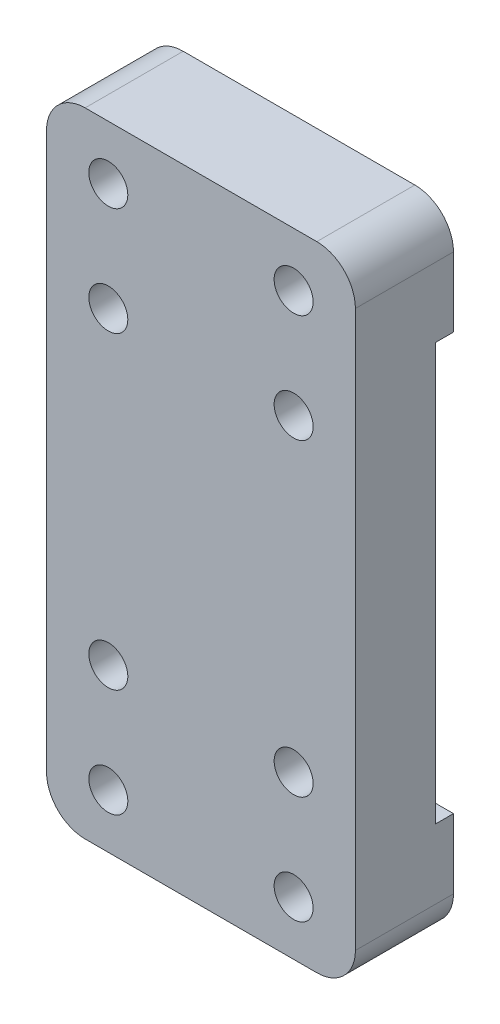
ISO-10303-21;
HEADER;
FILE_DESCRIPTION(('STEP AP214'),'2;1');
FILE_NAME('part.step','',(''),(''),'','','');
FILE_SCHEMA(('AUTOMOTIVE_DESIGN { 1 0 10303 214 1 1 1 1 }'));
ENDSEC;
DATA;
#1=APPLICATION_CONTEXT('core data for automotive mechanical design processes');
#2=APPLICATION_PROTOCOL_DEFINITION('international standard','automotive_design',2000,#1);
#3=PRODUCT_CONTEXT('',#1,'mechanical');
#4=PRODUCT('Part','Part','',(#3));
#5=PRODUCT_RELATED_PRODUCT_CATEGORY('part','',(#4));
#6=PRODUCT_DEFINITION_FORMATION('','',#4);
#7=PRODUCT_DEFINITION_CONTEXT('part definition',#1,'design');
#8=PRODUCT_DEFINITION('design','',#6,#7);
#9=PRODUCT_DEFINITION_SHAPE('','',#8);
#10=(LENGTH_UNIT() NAMED_UNIT(*) SI_UNIT(.MILLI.,.METRE.));
#11=(NAMED_UNIT(*) PLANE_ANGLE_UNIT() SI_UNIT($,.RADIAN.));
#12=(NAMED_UNIT(*) SI_UNIT($,.STERADIAN.) SOLID_ANGLE_UNIT());
#13=UNCERTAINTY_MEASURE_WITH_UNIT(LENGTH_MEASURE(1.E-05),#10,'distance_accuracy_value','');
#14=(GEOMETRIC_REPRESENTATION_CONTEXT(3) GLOBAL_UNCERTAINTY_ASSIGNED_CONTEXT((#13)) GLOBAL_UNIT_ASSIGNED_CONTEXT((#10,
#11,#12)) REPRESENTATION_CONTEXT('',''));
#15=CARTESIAN_POINT('',(0.,0.,0.));
#16=DIRECTION('',(0.,0.,1.));
#17=DIRECTION('',(1.,0.,0.));
#18=AXIS2_PLACEMENT_3D('',#15,#16,#17);
#19=CARTESIAN_POINT('',(0.,0.,0.));
#20=DIRECTION('',(0.,0.,-1.));
#21=DIRECTION('',(-1.,0.,0.));
#22=AXIS2_PLACEMENT_3D('',#19,#20,#21);
#23=PLANE('',#22);
#24=DIRECTION('',(1.,0.,0.));
#25=VECTOR('',#24,1.);
#26=CARTESIAN_POINT('',(-20.,-40.9999999999999,0.));
#27=LINE('',#26,#25);
#28=CARTESIAN_POINT('',(-15.,-40.9999999999999,0.));
#29=VERTEX_POINT('',#28);
#30=CARTESIAN_POINT('',(15.,-40.9999999999999,0.));
#31=VERTEX_POINT('',#30);
#32=EDGE_CURVE('E217',#29,#31,#27,.T.);
#33=ORIENTED_EDGE('',*,*,#32,.F.);
#34=CARTESIAN_POINT('',(-15.,-36.,0.));
#35=DIRECTION('',(0.,0.,-1.));
#36=DIRECTION('',(-1.,0.,0.));
#37=AXIS2_PLACEMENT_3D('',#34,#35,#36);
#38=CIRCLE('',#37,5.);
#39=CARTESIAN_POINT('',(-20.,-36.,0.));
#40=VERTEX_POINT('',#39);
#41=EDGE_CURVE('E244',#29,#40,#38,.T.);
#42=ORIENTED_EDGE('',*,*,#41,.T.);
#43=DIRECTION('',(0.,-1.,0.));
#44=VECTOR('',#43,1.);
#45=CARTESIAN_POINT('',(-20.,-40.9999999999999,0.));
#46=LINE('',#45,#44);
#47=CARTESIAN_POINT('',(-20.,-26.9999999999999,0.));
#48=VERTEX_POINT('',#47);
#49=EDGE_CURVE('E231',#48,#40,#46,.T.);
#50=ORIENTED_EDGE('',*,*,#49,.F.);
#51=DIRECTION('',(-1.,0.,0.));
#52=VECTOR('',#51,1.);
#53=CARTESIAN_POINT('',(20.,-26.9999999999999,0.));
#54=LINE('',#53,#52);
#55=CARTESIAN_POINT('',(20.,-26.9999999999999,0.));
#56=VERTEX_POINT('',#55);
#57=EDGE_CURVE('E154',#56,#48,#54,.T.);
#58=ORIENTED_EDGE('',*,*,#57,.F.);
#59=DIRECTION('',(0.,1.,0.));
#60=VECTOR('',#59,1.);
#61=CARTESIAN_POINT('',(20.,-40.9999999999999,0.));
#62=LINE('',#61,#60);
#63=CARTESIAN_POINT('',(20.,-36.,0.));
#64=VERTEX_POINT('',#63);
#65=EDGE_CURVE('E227',#64,#56,#62,.T.);
#66=ORIENTED_EDGE('',*,*,#65,.F.);
#67=CARTESIAN_POINT('',(15.,-36.,0.));
#68=DIRECTION('',(0.,0.,-1.));
#69=DIRECTION('',(-1.,0.,0.));
#70=AXIS2_PLACEMENT_3D('',#67,#68,#69);
#71=CIRCLE('',#70,5.);
#72=EDGE_CURVE('E242',#64,#31,#71,.T.);
#73=ORIENTED_EDGE('',*,*,#72,.T.);
#74=EDGE_LOOP('',(#33,#42,#50,#58,#66,#73));
#75=FACE_BOUND('',#74,.T.);
#76=CARTESIAN_POINT('',(-12.,-34.,0.));
#77=DIRECTION('',(0.,0.,1.));
#78=DIRECTION('',(-1.,0.,0.));
#79=AXIS2_PLACEMENT_3D('',#76,#77,#78);
#80=CIRCLE('',#79,2.525);
#81=CARTESIAN_POINT('',(-14.525,-34.,0.));
#82=VERTEX_POINT('',#81);
#83=EDGE_CURVE('E176',#82,#82,#80,.T.);
#84=ORIENTED_EDGE('',*,*,#83,.T.);
#85=EDGE_LOOP('',(#84));
#86=FACE_BOUND('',#85,.T.);
#87=CARTESIAN_POINT('',(12.,-34.,0.));
#88=DIRECTION('',(0.,0.,1.));
#89=DIRECTION('',(1.,0.,0.));
#90=AXIS2_PLACEMENT_3D('',#87,#88,#89);
#91=CIRCLE('',#90,2.52500000000001);
#92=CARTESIAN_POINT('',(14.525,-34.,0.));
#93=VERTEX_POINT('',#92);
#94=EDGE_CURVE('E185',#93,#93,#91,.T.);
#95=ORIENTED_EDGE('',*,*,#94,.T.);
#96=EDGE_LOOP('',(#95));
#97=FACE_BOUND('',#96,.T.);
#98=ADVANCED_FACE('F46',(#75,#86,#97),#23,.T.);
#99=CARTESIAN_POINT('',(0.,0.,12.7));
#100=DIRECTION('',(0.,0.,-1.));
#101=DIRECTION('',(-1.,0.,0.));
#102=AXIS2_PLACEMENT_3D('',#99,#100,#101);
#103=PLANE('',#102);
#104=DIRECTION('',(0.,-1.,0.));
#105=VECTOR('',#104,1.);
#106=CARTESIAN_POINT('',(-20.,-40.9999999999999,12.7));
#107=LINE('',#106,#105);
#108=CARTESIAN_POINT('',(-20.,36.,12.7));
#109=VERTEX_POINT('',#108);
#110=CARTESIAN_POINT('',(-20.,-36.,12.7));
#111=VERTEX_POINT('',#110);
#112=EDGE_CURVE('E220',#109,#111,#107,.T.);
#113=ORIENTED_EDGE('',*,*,#112,.T.);
#114=CARTESIAN_POINT('',(-15.,-36.,12.7));
#115=DIRECTION('',(0.,0.,-1.));
#116=DIRECTION('',(-1.,0.,0.));
#117=AXIS2_PLACEMENT_3D('',#114,#115,#116);
#118=CIRCLE('',#117,5.);
#119=CARTESIAN_POINT('',(-15.,-40.9999999999999,12.7));
#120=VERTEX_POINT('',#119);
#121=EDGE_CURVE('E256',#111,#120,#118,.F.);
#122=ORIENTED_EDGE('',*,*,#121,.T.);
#123=DIRECTION('',(1.,0.,0.));
#124=VECTOR('',#123,1.);
#125=CARTESIAN_POINT('',(-20.,-40.9999999999999,12.7));
#126=LINE('',#125,#124);
#127=CARTESIAN_POINT('',(15.,-40.9999999999999,12.7));
#128=VERTEX_POINT('',#127);
#129=EDGE_CURVE('E223',#120,#128,#126,.T.);
#130=ORIENTED_EDGE('',*,*,#129,.T.);
#131=CARTESIAN_POINT('',(15.,-36.,12.7));
#132=DIRECTION('',(0.,0.,-1.));
#133=DIRECTION('',(-1.,0.,0.));
#134=AXIS2_PLACEMENT_3D('',#131,#132,#133);
#135=CIRCLE('',#134,5.);
#136=CARTESIAN_POINT('',(20.,-36.,12.7));
#137=VERTEX_POINT('',#136);
#138=EDGE_CURVE('E254',#128,#137,#135,.F.);
#139=ORIENTED_EDGE('',*,*,#138,.T.);
#140=DIRECTION('',(0.,1.,0.));
#141=VECTOR('',#140,1.);
#142=CARTESIAN_POINT('',(20.,-40.9999999999999,12.7));
#143=LINE('',#142,#141);
#144=CARTESIAN_POINT('',(20.,36.,12.7));
#145=VERTEX_POINT('',#144);
#146=EDGE_CURVE('E213',#137,#145,#143,.T.);
#147=ORIENTED_EDGE('',*,*,#146,.T.);
#148=CARTESIAN_POINT('',(15.,36.,12.7));
#149=DIRECTION('',(0.,0.,-1.));
#150=DIRECTION('',(-1.,0.,0.));
#151=AXIS2_PLACEMENT_3D('',#148,#149,#150);
#152=CIRCLE('',#151,5.);
#153=CARTESIAN_POINT('',(15.,40.9999999999999,12.7));
#154=VERTEX_POINT('',#153);
#155=EDGE_CURVE('E252',#145,#154,#152,.F.);
#156=ORIENTED_EDGE('',*,*,#155,.T.);
#157=DIRECTION('',(-1.,0.,0.));
#158=VECTOR('',#157,1.);
#159=CARTESIAN_POINT('',(-20.,40.9999999999999,12.7));
#160=LINE('',#159,#158);
#161=CARTESIAN_POINT('',(-15.,40.9999999999999,12.7));
#162=VERTEX_POINT('',#161);
#163=EDGE_CURVE('E216',#154,#162,#160,.T.);
#164=ORIENTED_EDGE('',*,*,#163,.T.);
#165=CARTESIAN_POINT('',(-15.,36.,12.7));
#166=DIRECTION('',(0.,0.,-1.));
#167=DIRECTION('',(-1.,0.,0.));
#168=AXIS2_PLACEMENT_3D('',#165,#166,#167);
#169=CIRCLE('',#168,5.);
#170=EDGE_CURVE('E250',#162,#109,#169,.F.);
#171=ORIENTED_EDGE('',*,*,#170,.T.);
#172=EDGE_LOOP('',(#113,#122,#130,#139,#147,#156,#164,#171));
#173=FACE_BOUND('',#172,.T.);
#174=CARTESIAN_POINT('',(-12.,20.,12.7));
#175=DIRECTION('',(0.,0.,1.));
#176=DIRECTION('',(1.,0.,0.));
#177=AXIS2_PLACEMENT_3D('',#174,#175,#176);
#178=CIRCLE('',#177,2.525);
#179=CARTESIAN_POINT('',(-9.47500000000001,20.,12.7));
#180=VERTEX_POINT('',#179);
#181=EDGE_CURVE('E207',#180,#180,#178,.T.);
#182=ORIENTED_EDGE('',*,*,#181,.F.);
#183=EDGE_LOOP('',(#182));
#184=FACE_BOUND('',#183,.T.);
#185=CARTESIAN_POINT('',(-12.,34.,12.7));
#186=DIRECTION('',(0.,0.,1.));
#187=DIRECTION('',(1.,0.,0.));
#188=AXIS2_PLACEMENT_3D('',#185,#186,#187);
#189=CIRCLE('',#188,2.525);
#190=CARTESIAN_POINT('',(-9.47500000000001,34.,12.7));
#191=VERTEX_POINT('',#190);
#192=EDGE_CURVE('E204',#191,#191,#189,.T.);
#193=ORIENTED_EDGE('',*,*,#192,.F.);
#194=EDGE_LOOP('',(#193));
#195=FACE_BOUND('',#194,.T.);
#196=CARTESIAN_POINT('',(12.,34.,12.7));
#197=DIRECTION('',(0.,0.,1.));
#198=DIRECTION('',(-1.,0.,0.));
#199=AXIS2_PLACEMENT_3D('',#196,#197,#198);
#200=CIRCLE('',#199,2.525);
#201=CARTESIAN_POINT('',(9.47500000000001,34.,12.7));
#202=VERTEX_POINT('',#201);
#203=EDGE_CURVE('E198',#202,#202,#200,.T.);
#204=ORIENTED_EDGE('',*,*,#203,.F.);
#205=EDGE_LOOP('',(#204));
#206=FACE_BOUND('',#205,.T.);
#207=CARTESIAN_POINT('',(12.,20.,12.7));
#208=DIRECTION('',(0.,0.,1.));
#209=DIRECTION('',(-1.,0.,0.));
#210=AXIS2_PLACEMENT_3D('',#207,#208,#209);
#211=CIRCLE('',#210,2.525);
#212=CARTESIAN_POINT('',(9.47500000000001,20.,12.7));
#213=VERTEX_POINT('',#212);
#214=EDGE_CURVE('E194',#213,#213,#211,.T.);
#215=ORIENTED_EDGE('',*,*,#214,.F.);
#216=EDGE_LOOP('',(#215));
#217=FACE_BOUND('',#216,.T.);
#218=CARTESIAN_POINT('',(12.,-20.,12.7));
#219=DIRECTION('',(0.,0.,1.));
#220=DIRECTION('',(1.,0.,0.));
#221=AXIS2_PLACEMENT_3D('',#218,#219,#220);
#222=CIRCLE('',#221,2.52499999999999);
#223=CARTESIAN_POINT('',(14.525,-20.,12.7));
#224=VERTEX_POINT('',#223);
#225=EDGE_CURVE('E189',#224,#224,#222,.T.);
#226=ORIENTED_EDGE('',*,*,#225,.F.);
#227=EDGE_LOOP('',(#226));
#228=FACE_BOUND('',#227,.T.);
#229=CARTESIAN_POINT('',(12.,-34.,12.7));
#230=DIRECTION('',(0.,0.,1.));
#231=DIRECTION('',(1.,0.,0.));
#232=AXIS2_PLACEMENT_3D('',#229,#230,#231);
#233=CIRCLE('',#232,2.52500000000001);
#234=CARTESIAN_POINT('',(14.525,-34.,12.7));
#235=VERTEX_POINT('',#234);
#236=EDGE_CURVE('E186',#235,#235,#233,.T.);
#237=ORIENTED_EDGE('',*,*,#236,.F.);
#238=EDGE_LOOP('',(#237));
#239=FACE_BOUND('',#238,.T.);
#240=CARTESIAN_POINT('',(-12.,-20.,12.7));
#241=DIRECTION('',(0.,0.,1.));
#242=DIRECTION('',(-1.,0.,0.));
#243=AXIS2_PLACEMENT_3D('',#240,#241,#242);
#244=CIRCLE('',#243,2.525);
#245=CARTESIAN_POINT('',(-14.525,-20.,12.7));
#246=VERTEX_POINT('',#245);
#247=EDGE_CURVE('E180',#246,#246,#244,.T.);
#248=ORIENTED_EDGE('',*,*,#247,.F.);
#249=EDGE_LOOP('',(#248));
#250=FACE_BOUND('',#249,.T.);
#251=CARTESIAN_POINT('',(-12.,-34.,12.7));
#252=DIRECTION('',(0.,0.,1.));
#253=DIRECTION('',(-1.,0.,0.));
#254=AXIS2_PLACEMENT_3D('',#251,#252,#253);
#255=CIRCLE('',#254,2.525);
#256=CARTESIAN_POINT('',(-14.525,-34.,12.7));
#257=VERTEX_POINT('',#256);
#258=EDGE_CURVE('E177',#257,#257,#255,.T.);
#259=ORIENTED_EDGE('',*,*,#258,.F.);
#260=EDGE_LOOP('',(#259));
#261=FACE_BOUND('',#260,.T.);
#262=ADVANCED_FACE('F280',(#173,#184,#195,#206,#217,#228,#239,#250,#261),#103,.F.);
#263=DIRECTION('',(-1.,0.,0.));
#264=VECTOR('',#263,1.);
#265=CARTESIAN_POINT('',(-20.,40.9999999999999,0.));
#266=LINE('',#265,#264);
#267=CARTESIAN_POINT('',(15.,40.9999999999999,0.));
#268=VERTEX_POINT('',#267);
#269=CARTESIAN_POINT('',(-15.,40.9999999999999,0.));
#270=VERTEX_POINT('',#269);
#271=EDGE_CURVE('E229',#268,#270,#266,.T.);
#272=ORIENTED_EDGE('',*,*,#271,.F.);
#273=CARTESIAN_POINT('',(15.,36.,0.));
#274=DIRECTION('',(0.,0.,-1.));
#275=DIRECTION('',(-1.,0.,0.));
#276=AXIS2_PLACEMENT_3D('',#273,#274,#275);
#277=CIRCLE('',#276,5.);
#278=CARTESIAN_POINT('',(20.,36.,0.));
#279=VERTEX_POINT('',#278);
#280=EDGE_CURVE('E13',#268,#279,#277,.T.);
#281=ORIENTED_EDGE('',*,*,#280,.T.);
#282=CARTESIAN_POINT('',(20.,26.9999999999999,0.));
#283=VERTEX_POINT('',#282);
#284=EDGE_CURVE('E212',#283,#279,#62,.T.);
#285=ORIENTED_EDGE('',*,*,#284,.F.);
#286=DIRECTION('',(1.,0.,0.));
#287=VECTOR('',#286,1.);
#288=CARTESIAN_POINT('',(20.,26.9999999999999,0.));
#289=LINE('',#288,#287);
#290=CARTESIAN_POINT('',(-20.,26.9999999999999,0.));
#291=VERTEX_POINT('',#290);
#292=EDGE_CURVE('E308',#291,#283,#289,.T.);
#293=ORIENTED_EDGE('',*,*,#292,.F.);
#294=CARTESIAN_POINT('',(-20.,36.,0.));
#295=VERTEX_POINT('',#294);
#296=EDGE_CURVE('E159',#295,#291,#46,.T.);
#297=ORIENTED_EDGE('',*,*,#296,.F.);
#298=CARTESIAN_POINT('',(-15.,36.,0.));
#299=DIRECTION('',(0.,0.,-1.));
#300=DIRECTION('',(-1.,0.,0.));
#301=AXIS2_PLACEMENT_3D('',#298,#299,#300);
#302=CIRCLE('',#301,5.);
#303=EDGE_CURVE('E54',#295,#270,#302,.T.);
#304=ORIENTED_EDGE('',*,*,#303,.T.);
#305=EDGE_LOOP('',(#272,#281,#285,#293,#297,#304));
#306=FACE_BOUND('',#305,.T.);
#307=CARTESIAN_POINT('',(12.,34.,0.));
#308=DIRECTION('',(0.,0.,1.));
#309=DIRECTION('',(-1.,0.,0.));
#310=AXIS2_PLACEMENT_3D('',#307,#308,#309);
#311=CIRCLE('',#310,2.525);
#312=CARTESIAN_POINT('',(9.47500000000001,34.,0.));
#313=VERTEX_POINT('',#312);
#314=EDGE_CURVE('E197',#313,#313,#311,.T.);
#315=ORIENTED_EDGE('',*,*,#314,.T.);
#316=EDGE_LOOP('',(#315));
#317=FACE_BOUND('',#316,.T.);
#318=CARTESIAN_POINT('',(-12.,34.,0.));
#319=DIRECTION('',(0.,0.,1.));
#320=DIRECTION('',(1.,0.,0.));
#321=AXIS2_PLACEMENT_3D('',#318,#319,#320);
#322=CIRCLE('',#321,2.525);
#323=CARTESIAN_POINT('',(-9.47500000000001,34.,0.));
#324=VERTEX_POINT('',#323);
#325=EDGE_CURVE('E201',#324,#324,#322,.T.);
#326=ORIENTED_EDGE('',*,*,#325,.T.);
#327=EDGE_LOOP('',(#326));
#328=FACE_BOUND('',#327,.T.);
#329=ADVANCED_FACE('F271',(#306,#317,#328),#23,.T.);
#330=CARTESIAN_POINT('',(20.,-40.9999999999999,12.7));
#331=DIRECTION('',(-1.,0.,0.));
#332=DIRECTION('',(0.,0.,1.));
#333=AXIS2_PLACEMENT_3D('',#330,#331,#332);
#334=PLANE('',#333);
#335=ORIENTED_EDGE('',*,*,#146,.F.);
#336=DIRECTION('',(0.,0.,-1.));
#337=VECTOR('',#336,1.);
#338=CARTESIAN_POINT('',(20.,-36.,12.7));
#339=LINE('',#338,#337);
#340=EDGE_CURVE('E260',#137,#64,#339,.T.);
#341=ORIENTED_EDGE('',*,*,#340,.T.);
#342=ORIENTED_EDGE('',*,*,#65,.T.);
#343=DIRECTION('',(0.,0.,-1.));
#344=VECTOR('',#343,1.);
#345=CARTESIAN_POINT('',(20.,-26.9999999999999,2.30000000000002));
#346=LINE('',#345,#344);
#347=CARTESIAN_POINT('',(20.,-26.9999999999999,2.30000000000002));
#348=VERTEX_POINT('',#347);
#349=EDGE_CURVE('E161',#348,#56,#346,.T.);
#350=ORIENTED_EDGE('',*,*,#349,.F.);
#351=DIRECTION('',(0.,-1.,0.));
#352=VECTOR('',#351,1.);
#353=CARTESIAN_POINT('',(20.,-26.9999999999999,2.30000000000002));
#354=LINE('',#353,#352);
#355=CARTESIAN_POINT('',(20.,26.9999999999999,2.30000000000002));
#356=VERTEX_POINT('',#355);
#357=EDGE_CURVE('E144',#356,#348,#354,.T.);
#358=ORIENTED_EDGE('',*,*,#357,.F.);
#359=DIRECTION('',(0.,0.,-1.));
#360=VECTOR('',#359,1.);
#361=CARTESIAN_POINT('',(20.,26.9999999999999,2.30000000000002));
#362=LINE('',#361,#360);
#363=EDGE_CURVE('E141',#356,#283,#362,.T.);
#364=ORIENTED_EDGE('',*,*,#363,.T.);
#365=ORIENTED_EDGE('',*,*,#284,.T.);
#366=DIRECTION('',(0.,0.,-1.));
#367=VECTOR('',#366,1.);
#368=CARTESIAN_POINT('',(20.,36.,12.7));
#369=LINE('',#368,#367);
#370=EDGE_CURVE('E258',#279,#145,#369,.F.);
#371=ORIENTED_EDGE('',*,*,#370,.T.);
#372=EDGE_LOOP('',(#335,#341,#342,#350,#358,#364,#365,#371));
#373=FACE_BOUND('',#372,.T.);
#374=ADVANCED_FACE('F277',(#373),#334,.F.);
#375=CARTESIAN_POINT('',(-20.,40.9999999999999,12.7));
#376=DIRECTION('',(0.,-1.,0.));
#377=DIRECTION('',(1.,0.,0.));
#378=AXIS2_PLACEMENT_3D('',#375,#376,#377);
#379=PLANE('',#378);
#380=ORIENTED_EDGE('',*,*,#163,.F.);
#381=DIRECTION('',(0.,0.,-1.));
#382=VECTOR('',#381,1.);
#383=CARTESIAN_POINT('',(15.,40.9999999999999,12.7));
#384=LINE('',#383,#382);
#385=EDGE_CURVE('E265',#154,#268,#384,.T.);
#386=ORIENTED_EDGE('',*,*,#385,.T.);
#387=ORIENTED_EDGE('',*,*,#271,.T.);
#388=DIRECTION('',(0.,0.,-1.));
#389=VECTOR('',#388,1.);
#390=CARTESIAN_POINT('',(-15.,40.9999999999999,12.7));
#391=LINE('',#390,#389);
#392=EDGE_CURVE('E263',#270,#162,#391,.F.);
#393=ORIENTED_EDGE('',*,*,#392,.T.);
#394=EDGE_LOOP('',(#380,#386,#387,#393));
#395=FACE_BOUND('',#394,.T.);
#396=ADVANCED_FACE('F268',(#395),#379,.F.);
#397=CARTESIAN_POINT('',(-20.,-40.9999999999999,12.7));
#398=DIRECTION('',(1.,0.,0.));
#399=DIRECTION('',(0.,1.,0.));
#400=AXIS2_PLACEMENT_3D('',#397,#398,#399);
#401=PLANE('',#400);
#402=ORIENTED_EDGE('',*,*,#49,.T.);
#403=DIRECTION('',(0.,0.,-1.));
#404=VECTOR('',#403,1.);
#405=CARTESIAN_POINT('',(-20.,-36.,12.7));
#406=LINE('',#405,#404);
#407=EDGE_CURVE('E248',#40,#111,#406,.F.);
#408=ORIENTED_EDGE('',*,*,#407,.T.);
#409=ORIENTED_EDGE('',*,*,#112,.F.);
#410=DIRECTION('',(0.,0.,-1.));
#411=VECTOR('',#410,1.);
#412=CARTESIAN_POINT('',(-20.,36.,12.7));
#413=LINE('',#412,#411);
#414=EDGE_CURVE('E246',#109,#295,#413,.T.);
#415=ORIENTED_EDGE('',*,*,#414,.T.);
#416=ORIENTED_EDGE('',*,*,#296,.T.);
#417=DIRECTION('',(0.,0.,-1.));
#418=VECTOR('',#417,1.);
#419=CARTESIAN_POINT('',(-20.,26.9999999999999,2.30000000000002));
#420=LINE('',#419,#418);
#421=CARTESIAN_POINT('',(-20.,26.9999999999999,2.30000000000002));
#422=VERTEX_POINT('',#421);
#423=EDGE_CURVE('E138',#422,#291,#420,.T.);
#424=ORIENTED_EDGE('',*,*,#423,.F.);
#425=DIRECTION('',(0.,1.,0.));
#426=VECTOR('',#425,1.);
#427=CARTESIAN_POINT('',(-20.,-26.9999999999999,2.30000000000002));
#428=LINE('',#427,#426);
#429=CARTESIAN_POINT('',(-20.,-26.9999999999999,2.30000000000002));
#430=VERTEX_POINT('',#429);
#431=EDGE_CURVE('E145',#430,#422,#428,.T.);
#432=ORIENTED_EDGE('',*,*,#431,.F.);
#433=DIRECTION('',(0.,0.,-1.));
#434=VECTOR('',#433,1.);
#435=CARTESIAN_POINT('',(-20.,-26.9999999999999,2.30000000000002));
#436=LINE('',#435,#434);
#437=EDGE_CURVE('E237',#430,#48,#436,.T.);
#438=ORIENTED_EDGE('',*,*,#437,.T.);
#439=EDGE_LOOP('',(#402,#408,#409,#415,#416,#424,#432,#438));
#440=FACE_BOUND('',#439,.T.);
#441=ADVANCED_FACE('F157',(#440),#401,.F.);
#442=CARTESIAN_POINT('',(-20.,-40.9999999999999,12.7));
#443=DIRECTION('',(0.,1.,0.));
#444=DIRECTION('',(-1.,0.,0.));
#445=AXIS2_PLACEMENT_3D('',#442,#443,#444);
#446=PLANE('',#445);
#447=ORIENTED_EDGE('',*,*,#129,.F.);
#448=DIRECTION('',(0.,0.,-1.));
#449=VECTOR('',#448,1.);
#450=CARTESIAN_POINT('',(-15.,-40.9999999999999,12.7));
#451=LINE('',#450,#449);
#452=EDGE_CURVE('E239',#120,#29,#451,.T.);
#453=ORIENTED_EDGE('',*,*,#452,.T.);
#454=ORIENTED_EDGE('',*,*,#32,.T.);
#455=DIRECTION('',(0.,0.,-1.));
#456=VECTOR('',#455,1.);
#457=CARTESIAN_POINT('',(15.,-40.9999999999999,12.7));
#458=LINE('',#457,#456);
#459=EDGE_CURVE('E226',#31,#128,#458,.F.);
#460=ORIENTED_EDGE('',*,*,#459,.T.);
#461=EDGE_LOOP('',(#447,#453,#454,#460));
#462=FACE_BOUND('',#461,.T.);
#463=ADVANCED_FACE('F295',(#462),#446,.F.);
#464=CARTESIAN_POINT('',(-12.,20.,12.7));
#465=DIRECTION('',(0.,0.,-1.));
#466=DIRECTION('',(-1.,0.,0.));
#467=AXIS2_PLACEMENT_3D('',#464,#465,#466);
#468=CYLINDRICAL_SURFACE('',#467,2.525);
#469=CARTESIAN_POINT('',(-12.,20.,2.30000000000002));
#470=DIRECTION('',(0.,0.,1.));
#471=DIRECTION('',(1.,0.,0.));
#472=AXIS2_PLACEMENT_3D('',#469,#470,#471);
#473=CIRCLE('',#472,2.525);
#474=CARTESIAN_POINT('',(-9.47500000000001,20.,2.30000000000002));
#475=VERTEX_POINT('',#474);
#476=EDGE_CURVE('E173',#475,#475,#473,.T.);
#477=ORIENTED_EDGE('',*,*,#476,.F.);
#478=EDGE_LOOP('',(#477));
#479=FACE_BOUND('',#478,.T.);
#480=ORIENTED_EDGE('',*,*,#181,.T.);
#481=EDGE_LOOP('',(#480));
#482=FACE_BOUND('',#481,.T.);
#483=ADVANCED_FACE('F428',(#479,#482),#468,.F.);
#484=CARTESIAN_POINT('',(-12.,34.,12.7));
#485=DIRECTION('',(0.,0.,-1.));
#486=DIRECTION('',(-1.,0.,0.));
#487=AXIS2_PLACEMENT_3D('',#484,#485,#486);
#488=CYLINDRICAL_SURFACE('',#487,2.525);
#489=ORIENTED_EDGE('',*,*,#192,.T.);
#490=EDGE_LOOP('',(#489));
#491=FACE_BOUND('',#490,.T.);
#492=ORIENTED_EDGE('',*,*,#325,.F.);
#493=EDGE_LOOP('',(#492));
#494=FACE_BOUND('',#493,.T.);
#495=ADVANCED_FACE('F420',(#491,#494),#488,.F.);
#496=CARTESIAN_POINT('',(12.,34.,12.7));
#497=DIRECTION('',(0.,0.,-1.));
#498=DIRECTION('',(-1.,0.,0.));
#499=AXIS2_PLACEMENT_3D('',#496,#497,#498);
#500=CYLINDRICAL_SURFACE('',#499,2.525);
#501=ORIENTED_EDGE('',*,*,#203,.T.);
#502=EDGE_LOOP('',(#501));
#503=FACE_BOUND('',#502,.T.);
#504=ORIENTED_EDGE('',*,*,#314,.F.);
#505=EDGE_LOOP('',(#504));
#506=FACE_BOUND('',#505,.T.);
#507=ADVANCED_FACE('F412',(#503,#506),#500,.F.);
#508=CARTESIAN_POINT('',(12.,20.,12.7));
#509=DIRECTION('',(0.,0.,-1.));
#510=DIRECTION('',(-1.,0.,0.));
#511=AXIS2_PLACEMENT_3D('',#508,#509,#510);
#512=CYLINDRICAL_SURFACE('',#511,2.525);
#513=CARTESIAN_POINT('',(12.,20.,2.30000000000002));
#514=DIRECTION('',(0.,0.,1.));
#515=DIRECTION('',(1.,0.,0.));
#516=AXIS2_PLACEMENT_3D('',#513,#514,#515);
#517=CIRCLE('',#516,2.525);
#518=CARTESIAN_POINT('',(14.525,20.,2.30000000000002));
#519=VERTEX_POINT('',#518);
#520=EDGE_CURVE('E169',#519,#519,#517,.T.);
#521=ORIENTED_EDGE('',*,*,#520,.F.);
#522=EDGE_LOOP('',(#521));
#523=FACE_BOUND('',#522,.T.);
#524=ORIENTED_EDGE('',*,*,#214,.T.);
#525=EDGE_LOOP('',(#524));
#526=FACE_BOUND('',#525,.T.);
#527=ADVANCED_FACE('F404',(#523,#526),#512,.F.);
#528=CARTESIAN_POINT('',(12.,-20.,12.7));
#529=DIRECTION('',(0.,0.,-1.));
#530=DIRECTION('',(-1.,0.,0.));
#531=AXIS2_PLACEMENT_3D('',#528,#529,#530);
#532=CYLINDRICAL_SURFACE('',#531,2.52499999999999);
#533=CARTESIAN_POINT('',(12.,-20.,2.30000000000002));
#534=DIRECTION('',(0.,0.,1.));
#535=DIRECTION('',(1.,0.,0.));
#536=AXIS2_PLACEMENT_3D('',#533,#534,#535);
#537=CIRCLE('',#536,2.52499999999999);
#538=CARTESIAN_POINT('',(14.525,-20.,2.30000000000002));
#539=VERTEX_POINT('',#538);
#540=EDGE_CURVE('E166',#539,#539,#537,.T.);
#541=ORIENTED_EDGE('',*,*,#540,.F.);
#542=EDGE_LOOP('',(#541));
#543=FACE_BOUND('',#542,.T.);
#544=ORIENTED_EDGE('',*,*,#225,.T.);
#545=EDGE_LOOP('',(#544));
#546=FACE_BOUND('',#545,.T.);
#547=ADVANCED_FACE('F396',(#543,#546),#532,.F.);
#548=CARTESIAN_POINT('',(12.,-34.,12.7));
#549=DIRECTION('',(0.,0.,-1.));
#550=DIRECTION('',(-1.,0.,0.));
#551=AXIS2_PLACEMENT_3D('',#548,#549,#550);
#552=CYLINDRICAL_SURFACE('',#551,2.52500000000001);
#553=ORIENTED_EDGE('',*,*,#236,.T.);
#554=EDGE_LOOP('',(#553));
#555=FACE_BOUND('',#554,.T.);
#556=ORIENTED_EDGE('',*,*,#94,.F.);
#557=EDGE_LOOP('',(#556));
#558=FACE_BOUND('',#557,.T.);
#559=ADVANCED_FACE('F388',(#555,#558),#552,.F.);
#560=CARTESIAN_POINT('',(-12.,-20.,12.7));
#561=DIRECTION('',(0.,0.,-1.));
#562=DIRECTION('',(-1.,0.,0.));
#563=AXIS2_PLACEMENT_3D('',#560,#561,#562);
#564=CYLINDRICAL_SURFACE('',#563,2.525);
#565=CARTESIAN_POINT('',(-12.,-20.,2.30000000000002));
#566=DIRECTION('',(0.,0.,1.));
#567=DIRECTION('',(1.,0.,0.));
#568=AXIS2_PLACEMENT_3D('',#565,#566,#567);
#569=CIRCLE('',#568,2.525);
#570=CARTESIAN_POINT('',(-9.47500000000001,-20.,2.30000000000002));
#571=VERTEX_POINT('',#570);
#572=EDGE_CURVE('E170',#571,#571,#569,.T.);
#573=ORIENTED_EDGE('',*,*,#572,.F.);
#574=EDGE_LOOP('',(#573));
#575=FACE_BOUND('',#574,.T.);
#576=ORIENTED_EDGE('',*,*,#247,.T.);
#577=EDGE_LOOP('',(#576));
#578=FACE_BOUND('',#577,.T.);
#579=ADVANCED_FACE('F320',(#575,#578),#564,.F.);
#580=CARTESIAN_POINT('',(-12.,-34.,12.7));
#581=DIRECTION('',(0.,0.,-1.));
#582=DIRECTION('',(-1.,0.,0.));
#583=AXIS2_PLACEMENT_3D('',#580,#581,#582);
#584=CYLINDRICAL_SURFACE('',#583,2.525);
#585=ORIENTED_EDGE('',*,*,#258,.T.);
#586=EDGE_LOOP('',(#585));
#587=FACE_BOUND('',#586,.T.);
#588=ORIENTED_EDGE('',*,*,#83,.F.);
#589=EDGE_LOOP('',(#588));
#590=FACE_BOUND('',#589,.T.);
#591=ADVANCED_FACE('F313',(#587,#590),#584,.F.);
#592=CARTESIAN_POINT('',(20.,-26.9999999999999,2.30000000000002));
#593=DIRECTION('',(0.,-1.,0.));
#594=DIRECTION('',(1.,0.,0.));
#595=AXIS2_PLACEMENT_3D('',#592,#593,#594);
#596=PLANE('',#595);
#597=ORIENTED_EDGE('',*,*,#57,.T.);
#598=ORIENTED_EDGE('',*,*,#437,.F.);
#599=DIRECTION('',(-1.,0.,0.));
#600=VECTOR('',#599,1.);
#601=CARTESIAN_POINT('',(20.,-26.9999999999999,2.30000000000002));
#602=LINE('',#601,#600);
#603=EDGE_CURVE('E150',#348,#430,#602,.T.);
#604=ORIENTED_EDGE('',*,*,#603,.F.);
#605=ORIENTED_EDGE('',*,*,#349,.T.);
#606=EDGE_LOOP('',(#597,#598,#604,#605));
#607=FACE_BOUND('',#606,.T.);
#608=ADVANCED_FACE('F311',(#607),#596,.F.);
#609=CARTESIAN_POINT('',(20.,26.9999999999999,2.30000000000002));
#610=DIRECTION('',(0.,1.,0.));
#611=DIRECTION('',(-1.,0.,0.));
#612=AXIS2_PLACEMENT_3D('',#609,#610,#611);
#613=PLANE('',#612);
#614=ORIENTED_EDGE('',*,*,#292,.T.);
#615=ORIENTED_EDGE('',*,*,#363,.F.);
#616=DIRECTION('',(1.,0.,0.));
#617=VECTOR('',#616,1.);
#618=CARTESIAN_POINT('',(20.,26.9999999999999,2.30000000000002));
#619=LINE('',#618,#617);
#620=EDGE_CURVE('E134',#422,#356,#619,.T.);
#621=ORIENTED_EDGE('',*,*,#620,.F.);
#622=ORIENTED_EDGE('',*,*,#423,.T.);
#623=EDGE_LOOP('',(#614,#615,#621,#622));
#624=FACE_BOUND('',#623,.T.);
#625=ADVANCED_FACE('F136',(#624),#613,.F.);
#626=CARTESIAN_POINT('',(0.,0.,2.30000000000002));
#627=DIRECTION('',(0.,0.,1.));
#628=DIRECTION('',(1.,0.,0.));
#629=AXIS2_PLACEMENT_3D('',#626,#627,#628);
#630=PLANE('',#629);
#631=ORIENTED_EDGE('',*,*,#476,.T.);
#632=EDGE_LOOP('',(#631));
#633=FACE_BOUND('',#632,.T.);
#634=ORIENTED_EDGE('',*,*,#520,.T.);
#635=EDGE_LOOP('',(#634));
#636=FACE_BOUND('',#635,.T.);
#637=ORIENTED_EDGE('',*,*,#540,.T.);
#638=EDGE_LOOP('',(#637));
#639=FACE_BOUND('',#638,.T.);
#640=ORIENTED_EDGE('',*,*,#572,.T.);
#641=EDGE_LOOP('',(#640));
#642=FACE_BOUND('',#641,.T.);
#643=ORIENTED_EDGE('',*,*,#431,.T.);
#644=ORIENTED_EDGE('',*,*,#620,.T.);
#645=ORIENTED_EDGE('',*,*,#357,.T.);
#646=ORIENTED_EDGE('',*,*,#603,.T.);
#647=EDGE_LOOP('',(#643,#644,#645,#646));
#648=FACE_BOUND('',#647,.T.);
#649=ADVANCED_FACE('F148',(#633,#636,#639,#642,#648),#630,.F.);
#650=CARTESIAN_POINT('',(-15.,-36.,12.7));
#651=DIRECTION('',(0.,0.,-1.));
#652=DIRECTION('',(-1.,0.,0.));
#653=AXIS2_PLACEMENT_3D('',#650,#651,#652);
#654=CYLINDRICAL_SURFACE('',#653,5.);
#655=ORIENTED_EDGE('',*,*,#121,.F.);
#656=ORIENTED_EDGE('',*,*,#407,.F.);
#657=ORIENTED_EDGE('',*,*,#41,.F.);
#658=ORIENTED_EDGE('',*,*,#452,.F.);
#659=EDGE_LOOP('',(#655,#656,#657,#658));
#660=FACE_BOUND('',#659,.T.);
#661=ADVANCED_FACE('F299',(#660),#654,.T.);
#662=CARTESIAN_POINT('',(15.,-36.,12.7));
#663=DIRECTION('',(0.,0.,-1.));
#664=DIRECTION('',(-1.,0.,0.));
#665=AXIS2_PLACEMENT_3D('',#662,#663,#664);
#666=CYLINDRICAL_SURFACE('',#665,5.);
#667=ORIENTED_EDGE('',*,*,#138,.F.);
#668=ORIENTED_EDGE('',*,*,#459,.F.);
#669=ORIENTED_EDGE('',*,*,#72,.F.);
#670=ORIENTED_EDGE('',*,*,#340,.F.);
#671=EDGE_LOOP('',(#667,#668,#669,#670));
#672=FACE_BOUND('',#671,.T.);
#673=ADVANCED_FACE('F287',(#672),#666,.T.);
#674=CARTESIAN_POINT('',(15.,36.,12.7));
#675=DIRECTION('',(0.,0.,-1.));
#676=DIRECTION('',(-1.,0.,0.));
#677=AXIS2_PLACEMENT_3D('',#674,#675,#676);
#678=CYLINDRICAL_SURFACE('',#677,5.);
#679=ORIENTED_EDGE('',*,*,#155,.F.);
#680=ORIENTED_EDGE('',*,*,#370,.F.);
#681=ORIENTED_EDGE('',*,*,#280,.F.);
#682=ORIENTED_EDGE('',*,*,#385,.F.);
#683=EDGE_LOOP('',(#679,#680,#681,#682));
#684=FACE_BOUND('',#683,.T.);
#685=ADVANCED_FACE('F278',(#684),#678,.T.);
#686=CARTESIAN_POINT('',(-15.,36.,12.7));
#687=DIRECTION('',(0.,0.,-1.));
#688=DIRECTION('',(-1.,0.,0.));
#689=AXIS2_PLACEMENT_3D('',#686,#687,#688);
#690=CYLINDRICAL_SURFACE('',#689,5.);
#691=ORIENTED_EDGE('',*,*,#170,.F.);
#692=ORIENTED_EDGE('',*,*,#392,.F.);
#693=ORIENTED_EDGE('',*,*,#303,.F.);
#694=ORIENTED_EDGE('',*,*,#414,.F.);
#695=EDGE_LOOP('',(#691,#692,#693,#694));
#696=FACE_BOUND('',#695,.T.);
#697=ADVANCED_FACE('F48',(#696),#690,.T.);
#698=CLOSED_SHELL('',(#98,#262,#329,#374,#396,#441,#463,#483,#495,#507,#527,#547,#559,#579,#591,
#608,#625,#649,#661,#673,#685,#697));
#699=MANIFOLD_SOLID_BREP('B2',#698);
#700=ADVANCED_BREP_SHAPE_REPRESENTATION('',(#18,#699),#14);
#701=SHAPE_DEFINITION_REPRESENTATION(#9,#700);
ENDSEC;
END-ISO-10303-21;
